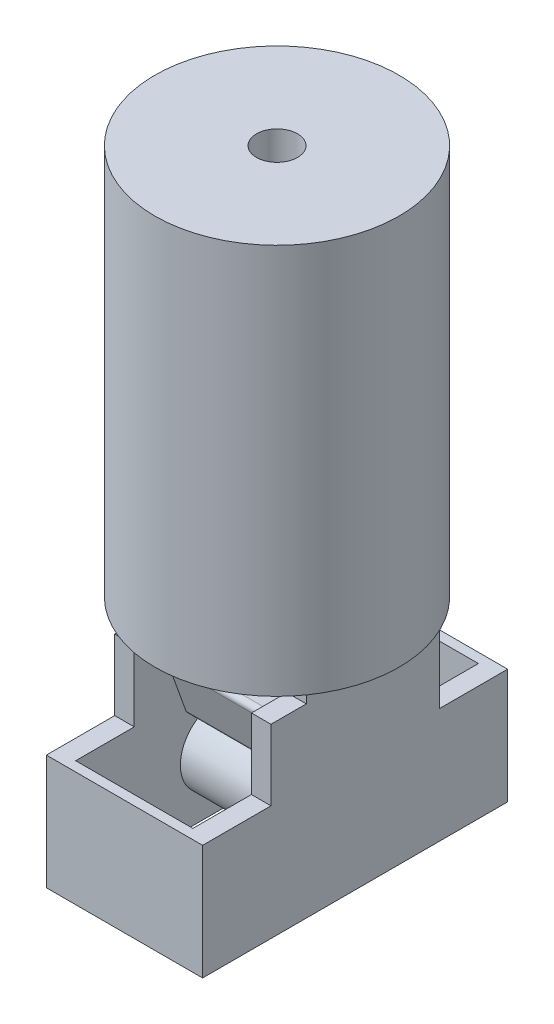
ISO-10303-21;
HEADER;
FILE_DESCRIPTION(('STEP AP214'),'2;1');
FILE_NAME('part.step','',(''),(''),'','','');
FILE_SCHEMA(('AUTOMOTIVE_DESIGN { 1 0 10303 214 1 1 1 1 }'));
ENDSEC;
DATA;
#1=APPLICATION_CONTEXT('core data for automotive mechanical design processes');
#2=APPLICATION_PROTOCOL_DEFINITION('international standard','automotive_design',2000,#1);
#3=PRODUCT_CONTEXT('',#1,'mechanical');
#4=PRODUCT('Part','Part','',(#3));
#5=PRODUCT_RELATED_PRODUCT_CATEGORY('part','',(#4));
#6=PRODUCT_DEFINITION_FORMATION('','',#4);
#7=PRODUCT_DEFINITION_CONTEXT('part definition',#1,'design');
#8=PRODUCT_DEFINITION('design','',#6,#7);
#9=PRODUCT_DEFINITION_SHAPE('','',#8);
#10=(LENGTH_UNIT() NAMED_UNIT(*) SI_UNIT(.MILLI.,.METRE.));
#11=(NAMED_UNIT(*) PLANE_ANGLE_UNIT() SI_UNIT($,.RADIAN.));
#12=(NAMED_UNIT(*) SI_UNIT($,.STERADIAN.) SOLID_ANGLE_UNIT());
#13=UNCERTAINTY_MEASURE_WITH_UNIT(LENGTH_MEASURE(1.E-05),#10,'distance_accuracy_value','');
#14=(GEOMETRIC_REPRESENTATION_CONTEXT(3) GLOBAL_UNCERTAINTY_ASSIGNED_CONTEXT((#13)) GLOBAL_UNIT_ASSIGNED_CONTEXT((#10,
#11,#12)) REPRESENTATION_CONTEXT('',''));
#15=CARTESIAN_POINT('',(0.,0.,0.));
#16=DIRECTION('',(0.,0.,1.));
#17=DIRECTION('',(1.,0.,0.));
#18=AXIS2_PLACEMENT_3D('',#15,#16,#17);
#19=CARTESIAN_POINT('',(12.,13.,14.6166247903554));
#20=DIRECTION('',(0.,-1.,0.));
#21=DIRECTION('',(0.,0.,-1.));
#22=AXIS2_PLACEMENT_3D('',#19,#20,#21);
#23=PLANE('',#22);
#24=DIRECTION('',(0.,0.,-1.));
#25=VECTOR('',#24,1.);
#26=CARTESIAN_POINT('',(-2.,13.,14.6166247903554));
#27=LINE('',#26,#25);
#28=CARTESIAN_POINT('',(-2.,13.,8.6166247903554));
#29=VERTEX_POINT('',#28);
#30=CARTESIAN_POINT('',(-2.,13.,5.));
#31=VERTEX_POINT('',#30);
#32=EDGE_CURVE('E381',#29,#31,#27,.T.);
#33=ORIENTED_EDGE('',*,*,#32,.F.);
#34=DIRECTION('',(-1.,0.,0.));
#35=VECTOR('',#34,1.);
#36=CARTESIAN_POINT('',(-2.,13.,8.6166247903554));
#37=LINE('',#36,#35);
#38=CARTESIAN_POINT('',(0.,13.,8.6166247903554));
#39=VERTEX_POINT('',#38);
#40=EDGE_CURVE('E254',#39,#29,#37,.T.);
#41=ORIENTED_EDGE('',*,*,#40,.F.);
#42=DIRECTION('',(0.,0.,-1.));
#43=VECTOR('',#42,1.);
#44=CARTESIAN_POINT('',(0.,13.,14.6166247903554));
#45=LINE('',#44,#43);
#46=CARTESIAN_POINT('',(0.,13.,5.));
#47=VERTEX_POINT('',#46);
#48=EDGE_CURVE('E384',#39,#47,#45,.T.);
#49=ORIENTED_EDGE('',*,*,#48,.T.);
#50=DIRECTION('',(1.,0.,0.));
#51=VECTOR('',#50,1.);
#52=CARTESIAN_POINT('',(-2.,13.,5.));
#53=LINE('',#52,#51);
#54=EDGE_CURVE('E461',#31,#47,#53,.T.);
#55=ORIENTED_EDGE('',*,*,#54,.F.);
#56=EDGE_LOOP('',(#33,#41,#49,#55));
#57=FACE_BOUND('',#56,.T.);
#58=ADVANCED_FACE('F39',(#57),#23,.F.);
#59=CARTESIAN_POINT('',(14.,13.,-14.6166247903554));
#60=DIRECTION('',(0.,-1.,0.));
#61=DIRECTION('',(0.,0.,-1.));
#62=AXIS2_PLACEMENT_3D('',#59,#60,#61);
#63=PLANE('',#62);
#64=DIRECTION('',(0.,0.,1.));
#65=VECTOR('',#64,1.);
#66=CARTESIAN_POINT('',(14.,13.,-14.6166247903554));
#67=LINE('',#66,#65);
#68=CARTESIAN_POINT('',(14.,13.,-8.6166247903554));
#69=VERTEX_POINT('',#68);
#70=CARTESIAN_POINT('',(14.,13.,-5.));
#71=VERTEX_POINT('',#70);
#72=EDGE_CURVE('E371',#69,#71,#67,.T.);
#73=ORIENTED_EDGE('',*,*,#72,.F.);
#74=DIRECTION('',(1.,0.,0.));
#75=VECTOR('',#74,1.);
#76=CARTESIAN_POINT('',(14.,13.,-8.6166247903554));
#77=LINE('',#76,#75);
#78=CARTESIAN_POINT('',(12.,13.,-8.6166247903554));
#79=VERTEX_POINT('',#78);
#80=EDGE_CURVE('E300',#79,#69,#77,.T.);
#81=ORIENTED_EDGE('',*,*,#80,.F.);
#82=DIRECTION('',(0.,0.,1.));
#83=VECTOR('',#82,1.);
#84=CARTESIAN_POINT('',(12.,13.,-14.6166247903554));
#85=LINE('',#84,#83);
#86=CARTESIAN_POINT('',(12.,13.,-5.));
#87=VERTEX_POINT('',#86);
#88=EDGE_CURVE('E374',#79,#87,#85,.T.);
#89=ORIENTED_EDGE('',*,*,#88,.T.);
#90=DIRECTION('',(-1.,0.,0.));
#91=VECTOR('',#90,1.);
#92=CARTESIAN_POINT('',(-2.,13.,-5.));
#93=LINE('',#92,#91);
#94=EDGE_CURVE('E474',#71,#87,#93,.T.);
#95=ORIENTED_EDGE('',*,*,#94,.F.);
#96=EDGE_LOOP('',(#73,#81,#89,#95));
#97=FACE_BOUND('',#96,.T.);
#98=ADVANCED_FACE('F648',(#97),#63,.F.);
#99=CARTESIAN_POINT('',(0.,13.,0.));
#100=DIRECTION('',(0.,1.,0.));
#101=DIRECTION('',(0.,0.,1.));
#102=AXIS2_PLACEMENT_3D('',#99,#100,#101);
#103=PLANE('',#102);
#104=DIRECTION('',(0.,0.,-1.));
#105=VECTOR('',#104,1.);
#106=CARTESIAN_POINT('',(0.,13.,3.3166247903554));
#107=LINE('',#106,#105);
#108=CARTESIAN_POINT('',(0.,13.,-5.));
#109=VERTEX_POINT('',#108);
#110=EDGE_CURVE('E499',#47,#109,#107,.T.);
#111=ORIENTED_EDGE('',*,*,#110,.T.);
#112=EDGE_CURVE('E479',#87,#109,#93,.T.);
#113=ORIENTED_EDGE('',*,*,#112,.F.);
#114=DIRECTION('',(0.,0.,1.));
#115=VECTOR('',#114,1.);
#116=CARTESIAN_POINT('',(12.,13.,-3.3166247903554));
#117=LINE('',#116,#115);
#118=CARTESIAN_POINT('',(12.,13.,5.));
#119=VERTEX_POINT('',#118);
#120=EDGE_CURVE('E503',#87,#119,#117,.T.);
#121=ORIENTED_EDGE('',*,*,#120,.T.);
#122=EDGE_CURVE('E483',#47,#119,#53,.T.);
#123=ORIENTED_EDGE('',*,*,#122,.F.);
#124=EDGE_LOOP('',(#111,#113,#121,#123));
#125=FACE_BOUND('',#124,.T.);
#126=ADVANCED_FACE('F632',(#125),#103,.F.);
#127=CARTESIAN_POINT('',(12.,0.,0.));
#128=DIRECTION('',(1.,0.,0.));
#129=DIRECTION('',(0.,0.,-1.));
#130=AXIS2_PLACEMENT_3D('',#127,#128,#129);
#131=PLANE('',#130);
#132=DIRECTION('',(0.,1.,0.));
#133=VECTOR('',#132,1.);
#134=CARTESIAN_POINT('',(12.,13.,-14.6166247903554));
#135=LINE('',#134,#133);
#136=CARTESIAN_POINT('',(12.,-6.,-14.6166247903554));
#137=VERTEX_POINT('',#136);
#138=CARTESIAN_POINT('',(12.,5.76669187086745,-14.6166247903554));
#139=VERTEX_POINT('',#138);
#140=EDGE_CURVE('E367',#137,#139,#135,.T.);
#141=ORIENTED_EDGE('',*,*,#140,.F.);
#142=DIRECTION('',(0.,0.,-1.));
#143=VECTOR('',#142,1.);
#144=CARTESIAN_POINT('',(12.,-6.,14.6166247903554));
#145=LINE('',#144,#143);
#146=CARTESIAN_POINT('',(12.,-6.,14.6166247903554));
#147=VERTEX_POINT('',#146);
#148=EDGE_CURVE('E405',#147,#137,#145,.T.);
#149=ORIENTED_EDGE('',*,*,#148,.F.);
#150=DIRECTION('',(0.,-1.,0.));
#151=VECTOR('',#150,1.);
#152=CARTESIAN_POINT('',(12.,-6.,14.6166247903554));
#153=LINE('',#152,#151);
#154=CARTESIAN_POINT('',(12.,5.76669187086745,14.6166247903554));
#155=VERTEX_POINT('',#154);
#156=EDGE_CURVE('E393',#155,#147,#153,.T.);
#157=ORIENTED_EDGE('',*,*,#156,.F.);
#158=DIRECTION('',(0.,0.,-1.));
#159=VECTOR('',#158,1.);
#160=CARTESIAN_POINT('',(12.,5.76669187086745,0.));
#161=LINE('',#160,#159);
#162=CARTESIAN_POINT('',(12.,5.76669187086745,8.6166247903554));
#163=VERTEX_POINT('',#162);
#164=EDGE_CURVE('E54',#155,#163,#161,.T.);
#165=ORIENTED_EDGE('',*,*,#164,.T.);
#166=DIRECTION('',(0.,1.,0.));
#167=VECTOR('',#166,1.);
#168=CARTESIAN_POINT('',(12.,0.,8.6166247903554));
#169=LINE('',#168,#167);
#170=CARTESIAN_POINT('',(12.,13.,8.6166247903554));
#171=VERTEX_POINT('',#170);
#172=EDGE_CURVE('E283',#163,#171,#169,.T.);
#173=ORIENTED_EDGE('',*,*,#172,.T.);
#174=DIRECTION('',(0.,0.,-1.));
#175=VECTOR('',#174,1.);
#176=CARTESIAN_POINT('',(12.,13.,14.6166247903554));
#177=LINE('',#176,#175);
#178=EDGE_CURVE('E396',#171,#119,#177,.T.);
#179=ORIENTED_EDGE('',*,*,#178,.T.);
#180=ORIENTED_EDGE('',*,*,#120,.F.);
#181=ORIENTED_EDGE('',*,*,#88,.F.);
#182=DIRECTION('',(0.,-1.,0.));
#183=VECTOR('',#182,1.);
#184=CARTESIAN_POINT('',(12.,0.,-8.6166247903554));
#185=LINE('',#184,#183);
#186=CARTESIAN_POINT('',(12.,5.76669187086745,-8.6166247903554));
#187=VERTEX_POINT('',#186);
#188=EDGE_CURVE('E323',#79,#187,#185,.T.);
#189=ORIENTED_EDGE('',*,*,#188,.T.);
#190=DIRECTION('',(0.,0.,-1.));
#191=VECTOR('',#190,1.);
#192=CARTESIAN_POINT('',(12.,5.76669187086745,0.));
#193=LINE('',#192,#191);
#194=EDGE_CURVE('E315',#187,#139,#193,.T.);
#195=ORIENTED_EDGE('',*,*,#194,.T.);
#196=EDGE_LOOP('',(#141,#149,#157,#165,#173,#179,#180,#181,#189,#195));
#197=FACE_BOUND('',#196,.T.);
#198=CARTESIAN_POINT('',(12.,4.7,-2.84858678977654));
#199=DIRECTION('',(1.,0.,0.));
#200=DIRECTION('',(0.,0.,-1.));
#201=AXIS2_PLACEMENT_3D('',#198,#199,#200);
#202=CIRCLE('',#201,0.5);
#203=CARTESIAN_POINT('',(12.,4.2,-2.84858678977654));
#204=VERTEX_POINT('',#203);
#205=CARTESIAN_POINT('',(12.,4.53064026586363,-3.31903049571091));
#206=VERTEX_POINT('',#205);
#207=EDGE_CURVE('E559',#204,#206,#202,.T.);
#208=ORIENTED_EDGE('',*,*,#207,.T.);
#209=DIRECTION('',(0.,-0.940887411868727,0.338719468272742));
#210=VECTOR('',#209,1.);
#211=CARTESIAN_POINT('',(12.,9.2,-5.));
#212=LINE('',#211,#210);
#213=CARTESIAN_POINT('',(12.,9.53064026586363,-5.11903049571091));
#214=VERTEX_POINT('',#213);
#215=EDGE_CURVE('E409',#214,#206,#212,.T.);
#216=ORIENTED_EDGE('',*,*,#215,.F.);
#217=CARTESIAN_POINT('',(12.,9.7,-4.64858678977655));
#218=DIRECTION('',(-1.,0.,0.));
#219=DIRECTION('',(0.,0.,1.));
#220=AXIS2_PLACEMENT_3D('',#217,#218,#219);
#221=CIRCLE('',#220,0.5);
#222=CARTESIAN_POINT('',(12.,10.2,-4.64858678977655));
#223=VERTEX_POINT('',#222);
#224=EDGE_CURVE('E522',#214,#223,#221,.F.);
#225=ORIENTED_EDGE('',*,*,#224,.T.);
#226=DIRECTION('',(0.,0.,-1.));
#227=VECTOR('',#226,1.);
#228=CARTESIAN_POINT('',(12.,10.2,-5.36));
#229=LINE('',#228,#227);
#230=CARTESIAN_POINT('',(12.,10.2,4.64858678977654));
#231=VERTEX_POINT('',#230);
#232=EDGE_CURVE('E414',#231,#223,#229,.T.);
#233=ORIENTED_EDGE('',*,*,#232,.F.);
#234=CARTESIAN_POINT('',(12.,9.7,4.64858678977654));
#235=DIRECTION('',(-1.,0.,0.));
#236=DIRECTION('',(0.,0.,1.));
#237=AXIS2_PLACEMENT_3D('',#234,#235,#236);
#238=CIRCLE('',#237,0.5);
#239=CARTESIAN_POINT('',(12.,9.53064026586363,5.1190304957109));
#240=VERTEX_POINT('',#239);
#241=EDGE_CURVE('E537',#231,#240,#238,.F.);
#242=ORIENTED_EDGE('',*,*,#241,.T.);
#243=DIRECTION('',(0.,0.940887411868727,0.338719468272741));
#244=VECTOR('',#243,1.);
#245=CARTESIAN_POINT('',(12.,10.2,5.36));
#246=LINE('',#245,#244);
#247=CARTESIAN_POINT('',(12.,4.53064026586363,3.31903049571091));
#248=VERTEX_POINT('',#247);
#249=EDGE_CURVE('E417',#248,#240,#246,.T.);
#250=ORIENTED_EDGE('',*,*,#249,.F.);
#251=CARTESIAN_POINT('',(12.,4.7,2.84858678977654));
#252=DIRECTION('',(1.,0.,0.));
#253=DIRECTION('',(0.,0.,-1.));
#254=AXIS2_PLACEMENT_3D('',#251,#252,#253);
#255=CIRCLE('',#254,0.5);
#256=CARTESIAN_POINT('',(12.,4.2,2.84858678977654));
#257=VERTEX_POINT('',#256);
#258=EDGE_CURVE('E565',#248,#257,#255,.T.);
#259=ORIENTED_EDGE('',*,*,#258,.T.);
#260=DIRECTION('',(0.,0.,1.));
#261=VECTOR('',#260,1.);
#262=CARTESIAN_POINT('',(12.,4.2,-3.2));
#263=LINE('',#262,#261);
#264=EDGE_CURVE('E408',#204,#257,#263,.T.);
#265=ORIENTED_EDGE('',*,*,#264,.F.);
#266=EDGE_LOOP('',(#208,#216,#225,#233,#242,#250,#259,#265));
#267=FACE_BOUND('',#266,.T.);
#268=CARTESIAN_POINT('',(12.,0.,0.));
#269=DIRECTION('',(1.,0.,0.));
#270=DIRECTION('',(0.,0.,-1.));
#271=AXIS2_PLACEMENT_3D('',#268,#269,#270);
#272=CIRCLE('',#271,3.9);
#273=CARTESIAN_POINT('',(12.,0.,-3.9));
#274=VERTEX_POINT('',#273);
#275=EDGE_CURVE('E508',#274,#274,#272,.T.);
#276=ORIENTED_EDGE('',*,*,#275,.T.);
#277=EDGE_LOOP('',(#276));
#278=FACE_BOUND('',#277,.T.);
#279=ADVANCED_FACE('F577',(#197,#267,#278),#131,.F.);
#280=CARTESIAN_POINT('',(0.,0.,0.));
#281=DIRECTION('',(-1.,0.,0.));
#282=DIRECTION('',(0.,0.,1.));
#283=AXIS2_PLACEMENT_3D('',#280,#281,#282);
#284=PLANE('',#283);
#285=DIRECTION('',(0.,0.,-1.));
#286=VECTOR('',#285,1.);
#287=CARTESIAN_POINT('',(0.,-6.,14.6166247903554));
#288=LINE('',#287,#286);
#289=CARTESIAN_POINT('',(0.,-6.,14.6166247903554));
#290=VERTEX_POINT('',#289);
#291=CARTESIAN_POINT('',(0.,-6.,-14.6166247903554));
#292=VERTEX_POINT('',#291);
#293=EDGE_CURVE('E387',#290,#292,#288,.T.);
#294=ORIENTED_EDGE('',*,*,#293,.T.);
#295=DIRECTION('',(0.,-1.,0.));
#296=VECTOR('',#295,1.);
#297=CARTESIAN_POINT('',(0.,-6.,-14.6166247903554));
#298=LINE('',#297,#296);
#299=CARTESIAN_POINT('',(0.,5.76669187086745,-14.6166247903554));
#300=VERTEX_POINT('',#299);
#301=EDGE_CURVE('E354',#300,#292,#298,.T.);
#302=ORIENTED_EDGE('',*,*,#301,.F.);
#303=DIRECTION('',(0.,0.,1.));
#304=VECTOR('',#303,1.);
#305=CARTESIAN_POINT('',(0.,5.76669187086745,0.));
#306=LINE('',#305,#304);
#307=CARTESIAN_POINT('',(0.,5.76669187086745,-8.6166247903554));
#308=VERTEX_POINT('',#307);
#309=EDGE_CURVE('E62',#300,#308,#306,.T.);
#310=ORIENTED_EDGE('',*,*,#309,.T.);
#311=DIRECTION('',(0.,1.,0.));
#312=VECTOR('',#311,1.);
#313=CARTESIAN_POINT('',(0.,0.,-8.6166247903554));
#314=LINE('',#313,#312);
#315=CARTESIAN_POINT('',(0.,13.,-8.6166247903554));
#316=VERTEX_POINT('',#315);
#317=EDGE_CURVE('E319',#308,#316,#314,.T.);
#318=ORIENTED_EDGE('',*,*,#317,.T.);
#319=DIRECTION('',(0.,0.,1.));
#320=VECTOR('',#319,1.);
#321=CARTESIAN_POINT('',(0.,13.,-14.6166247903554));
#322=LINE('',#321,#320);
#323=EDGE_CURVE('E361',#316,#109,#322,.T.);
#324=ORIENTED_EDGE('',*,*,#323,.T.);
#325=ORIENTED_EDGE('',*,*,#110,.F.);
#326=ORIENTED_EDGE('',*,*,#48,.F.);
#327=DIRECTION('',(0.,-1.,0.));
#328=VECTOR('',#327,1.);
#329=CARTESIAN_POINT('',(0.,0.,8.6166247903554));
#330=LINE('',#329,#328);
#331=CARTESIAN_POINT('',(0.,5.76669187086745,8.6166247903554));
#332=VERTEX_POINT('',#331);
#333=EDGE_CURVE('E280',#39,#332,#330,.T.);
#334=ORIENTED_EDGE('',*,*,#333,.T.);
#335=DIRECTION('',(0.,0.,1.));
#336=VECTOR('',#335,1.);
#337=CARTESIAN_POINT('',(0.,5.76669187086745,0.));
#338=LINE('',#337,#336);
#339=CARTESIAN_POINT('',(0.,5.76669187086745,14.6166247903554));
#340=VERTEX_POINT('',#339);
#341=EDGE_CURVE('E243',#332,#340,#338,.T.);
#342=ORIENTED_EDGE('',*,*,#341,.T.);
#343=DIRECTION('',(0.,1.,0.));
#344=VECTOR('',#343,1.);
#345=CARTESIAN_POINT('',(0.,13.,14.6166247903554));
#346=LINE('',#345,#344);
#347=EDGE_CURVE('E377',#290,#340,#346,.T.);
#348=ORIENTED_EDGE('',*,*,#347,.F.);
#349=EDGE_LOOP('',(#294,#302,#310,#318,#324,#325,#326,#334,#342,#348));
#350=FACE_BOUND('',#349,.T.);
#351=CARTESIAN_POINT('',(0.,4.7,-2.84858678977654));
#352=DIRECTION('',(-1.,0.,0.));
#353=DIRECTION('',(0.,0.,1.));
#354=AXIS2_PLACEMENT_3D('',#351,#352,#353);
#355=CIRCLE('',#354,0.5);
#356=CARTESIAN_POINT('',(0.,4.53064026586363,-3.31903049571091));
#357=VERTEX_POINT('',#356);
#358=CARTESIAN_POINT('',(0.,4.2,-2.84858678977654));
#359=VERTEX_POINT('',#358);
#360=EDGE_CURVE('E562',#357,#359,#355,.T.);
#361=ORIENTED_EDGE('',*,*,#360,.T.);
#362=DIRECTION('',(0.,0.,1.));
#363=VECTOR('',#362,1.);
#364=CARTESIAN_POINT('',(0.,4.2,-3.2));
#365=LINE('',#364,#363);
#366=CARTESIAN_POINT('',(0.,4.2,2.84858678977654));
#367=VERTEX_POINT('',#366);
#368=EDGE_CURVE('E433',#359,#367,#365,.T.);
#369=ORIENTED_EDGE('',*,*,#368,.T.);
#370=CARTESIAN_POINT('',(0.,4.7,2.84858678977654));
#371=DIRECTION('',(-1.,0.,0.));
#372=DIRECTION('',(0.,0.,1.));
#373=AXIS2_PLACEMENT_3D('',#370,#371,#372);
#374=CIRCLE('',#373,0.5);
#375=CARTESIAN_POINT('',(0.,4.53064026586363,3.31903049571091));
#376=VERTEX_POINT('',#375);
#377=EDGE_CURVE('E568',#367,#376,#374,.T.);
#378=ORIENTED_EDGE('',*,*,#377,.T.);
#379=DIRECTION('',(0.,0.940887411868727,0.338719468272741));
#380=VECTOR('',#379,1.);
#381=CARTESIAN_POINT('',(0.,10.2,5.36));
#382=LINE('',#381,#380);
#383=CARTESIAN_POINT('',(0.,9.53064026586363,5.1190304957109));
#384=VERTEX_POINT('',#383);
#385=EDGE_CURVE('E429',#376,#384,#382,.T.);
#386=ORIENTED_EDGE('',*,*,#385,.T.);
#387=CARTESIAN_POINT('',(0.,9.7,4.64858678977654));
#388=DIRECTION('',(-1.,0.,0.));
#389=DIRECTION('',(0.,0.,1.));
#390=AXIS2_PLACEMENT_3D('',#387,#388,#389);
#391=CIRCLE('',#390,0.5);
#392=CARTESIAN_POINT('',(0.,10.2,4.64858678977654));
#393=VERTEX_POINT('',#392);
#394=EDGE_CURVE('E548',#384,#393,#391,.T.);
#395=ORIENTED_EDGE('',*,*,#394,.T.);
#396=DIRECTION('',(0.,0.,-1.));
#397=VECTOR('',#396,1.);
#398=CARTESIAN_POINT('',(0.,10.2,-5.36));
#399=LINE('',#398,#397);
#400=CARTESIAN_POINT('',(0.,10.2,-4.64858678977655));
#401=VERTEX_POINT('',#400);
#402=EDGE_CURVE('E424',#393,#401,#399,.T.);
#403=ORIENTED_EDGE('',*,*,#402,.T.);
#404=CARTESIAN_POINT('',(0.,9.7,-4.64858678977655));
#405=DIRECTION('',(-1.,0.,0.));
#406=DIRECTION('',(0.,0.,1.));
#407=AXIS2_PLACEMENT_3D('',#404,#405,#406);
#408=CIRCLE('',#407,0.5);
#409=CARTESIAN_POINT('',(0.,9.53064026586363,-5.11903049571091));
#410=VERTEX_POINT('',#409);
#411=EDGE_CURVE('E533',#401,#410,#408,.T.);
#412=ORIENTED_EDGE('',*,*,#411,.T.);
#413=DIRECTION('',(0.,-0.940887411868727,0.338719468272742));
#414=VECTOR('',#413,1.);
#415=CARTESIAN_POINT('',(0.,9.2,-5.));
#416=LINE('',#415,#414);
#417=EDGE_CURVE('E413',#410,#357,#416,.T.);
#418=ORIENTED_EDGE('',*,*,#417,.T.);
#419=EDGE_LOOP('',(#361,#369,#378,#386,#395,#403,#412,#418));
#420=FACE_BOUND('',#419,.T.);
#421=CARTESIAN_POINT('',(0.,0.,0.));
#422=DIRECTION('',(1.,0.,0.));
#423=DIRECTION('',(0.,0.,-1.));
#424=AXIS2_PLACEMENT_3D('',#421,#422,#423);
#425=CIRCLE('',#424,3.9);
#426=CARTESIAN_POINT('',(0.,0.,-3.9));
#427=VERTEX_POINT('',#426);
#428=EDGE_CURVE('E507',#427,#427,#425,.T.);
#429=ORIENTED_EDGE('',*,*,#428,.F.);
#430=EDGE_LOOP('',(#429));
#431=FACE_BOUND('',#430,.T.);
#432=ADVANCED_FACE('F592',(#350,#420,#431),#284,.F.);
#433=CARTESIAN_POINT('',(14.,0.,0.));
#434=DIRECTION('',(1.,0.,0.));
#435=DIRECTION('',(0.,0.,-1.));
#436=AXIS2_PLACEMENT_3D('',#433,#434,#435);
#437=PLANE('',#436);
#438=DIRECTION('',(0.,0.,-1.));
#439=VECTOR('',#438,1.);
#440=CARTESIAN_POINT('',(14.,-6.,14.6166247903554));
#441=LINE('',#440,#439);
#442=CARTESIAN_POINT('',(14.,-6.,15.6166247903554));
#443=VERTEX_POINT('',#442);
#444=CARTESIAN_POINT('',(14.,-6.,-15.6166247903554));
#445=VERTEX_POINT('',#444);
#446=EDGE_CURVE('E402',#443,#445,#441,.T.);
#447=ORIENTED_EDGE('',*,*,#446,.T.);
#448=DIRECTION('',(0.,-1.,0.));
#449=VECTOR('',#448,1.);
#450=CARTESIAN_POINT('',(14.,-6.,-15.6166247903554));
#451=LINE('',#450,#449);
#452=CARTESIAN_POINT('',(14.,5.76669187086745,-15.6166247903554));
#453=VERTEX_POINT('',#452);
#454=EDGE_CURVE('E328',#453,#445,#451,.T.);
#455=ORIENTED_EDGE('',*,*,#454,.F.);
#456=DIRECTION('',(0.,0.,-1.));
#457=VECTOR('',#456,1.);
#458=CARTESIAN_POINT('',(14.,5.76669187086745,-8.6166247903554));
#459=LINE('',#458,#457);
#460=CARTESIAN_POINT('',(14.,5.76669187086745,-8.6166247903554));
#461=VERTEX_POINT('',#460);
#462=EDGE_CURVE('E304',#461,#453,#459,.T.);
#463=ORIENTED_EDGE('',*,*,#462,.F.);
#464=DIRECTION('',(0.,-1.,0.));
#465=VECTOR('',#464,1.);
#466=CARTESIAN_POINT('',(14.,5.76669187086745,-8.6166247903554));
#467=LINE('',#466,#465);
#468=EDGE_CURVE('E288',#69,#461,#467,.T.);
#469=ORIENTED_EDGE('',*,*,#468,.F.);
#470=ORIENTED_EDGE('',*,*,#72,.T.);
#471=DIRECTION('',(0.,-1.,0.));
#472=VECTOR('',#471,1.);
#473=CARTESIAN_POINT('',(14.,16.,-5.));
#474=LINE('',#473,#472);
#475=CARTESIAN_POINT('',(14.,16.,-5.));
#476=VERTEX_POINT('',#475);
#477=EDGE_CURVE('E495',#476,#71,#474,.T.);
#478=ORIENTED_EDGE('',*,*,#477,.F.);
#479=DIRECTION('',(0.,0.,-1.));
#480=VECTOR('',#479,1.);
#481=CARTESIAN_POINT('',(14.,16.,-5.));
#482=LINE('',#481,#480);
#483=CARTESIAN_POINT('',(14.,16.,5.));
#484=VERTEX_POINT('',#483);
#485=EDGE_CURVE('E456',#484,#476,#482,.T.);
#486=ORIENTED_EDGE('',*,*,#485,.F.);
#487=DIRECTION('',(0.,-1.,0.));
#488=VECTOR('',#487,1.);
#489=CARTESIAN_POINT('',(14.,16.,5.));
#490=LINE('',#489,#488);
#491=CARTESIAN_POINT('',(14.,13.,5.));
#492=VERTEX_POINT('',#491);
#493=EDGE_CURVE('E473',#484,#492,#490,.T.);
#494=ORIENTED_EDGE('',*,*,#493,.T.);
#495=DIRECTION('',(0.,0.,-1.));
#496=VECTOR('',#495,1.);
#497=CARTESIAN_POINT('',(14.,13.,14.6166247903554));
#498=LINE('',#497,#496);
#499=CARTESIAN_POINT('',(14.,13.,8.6166247903554));
#500=VERTEX_POINT('',#499);
#501=EDGE_CURVE('E399',#500,#492,#498,.T.);
#502=ORIENTED_EDGE('',*,*,#501,.F.);
#503=DIRECTION('',(0.,1.,0.));
#504=VECTOR('',#503,1.);
#505=CARTESIAN_POINT('',(14.,13.,8.6166247903554));
#506=LINE('',#505,#504);
#507=CARTESIAN_POINT('',(14.,5.76669187086745,8.6166247903554));
#508=VERTEX_POINT('',#507);
#509=EDGE_CURVE('E247',#508,#500,#506,.T.);
#510=ORIENTED_EDGE('',*,*,#509,.F.);
#511=DIRECTION('',(0.,0.,1.));
#512=VECTOR('',#511,1.);
#513=CARTESIAN_POINT('',(14.,5.76669187086745,8.6166247903554));
#514=LINE('',#513,#512);
#515=CARTESIAN_POINT('',(14.,5.76669187086745,15.6166247903554));
#516=VERTEX_POINT('',#515);
#517=EDGE_CURVE('E266',#508,#516,#514,.T.);
#518=ORIENTED_EDGE('',*,*,#517,.T.);
#519=DIRECTION('',(0.,1.,0.));
#520=VECTOR('',#519,1.);
#521=CARTESIAN_POINT('',(14.,13.,15.6166247903554));
#522=LINE('',#521,#520);
#523=EDGE_CURVE('E350',#443,#516,#522,.T.);
#524=ORIENTED_EDGE('',*,*,#523,.F.);
#525=EDGE_LOOP('',(#447,#455,#463,#469,#470,#478,#486,#494,#502,#510,#518,#524));
#526=FACE_BOUND('',#525,.T.);
#527=ADVANCED_FACE('F607',(#526),#437,.T.);
#528=CARTESIAN_POINT('',(-2.,0.,0.));
#529=DIRECTION('',(-1.,0.,0.));
#530=DIRECTION('',(0.,0.,1.));
#531=AXIS2_PLACEMENT_3D('',#528,#529,#530);
#532=PLANE('',#531);
#533=DIRECTION('',(0.,1.,0.));
#534=VECTOR('',#533,1.);
#535=CARTESIAN_POINT('',(-2.,13.,-15.6166247903554));
#536=LINE('',#535,#534);
#537=CARTESIAN_POINT('',(-2.,-6.,-15.6166247903554));
#538=VERTEX_POINT('',#537);
#539=CARTESIAN_POINT('',(-2.,5.76669187086745,-15.6166247903554));
#540=VERTEX_POINT('',#539);
#541=EDGE_CURVE('E336',#538,#540,#536,.T.);
#542=ORIENTED_EDGE('',*,*,#541,.F.);
#543=DIRECTION('',(0.,0.,-1.));
#544=VECTOR('',#543,1.);
#545=CARTESIAN_POINT('',(-2.,-6.,14.6166247903554));
#546=LINE('',#545,#544);
#547=CARTESIAN_POINT('',(-2.,-6.,15.6166247903554));
#548=VERTEX_POINT('',#547);
#549=EDGE_CURVE('E390',#548,#538,#546,.T.);
#550=ORIENTED_EDGE('',*,*,#549,.F.);
#551=DIRECTION('',(0.,-1.,0.));
#552=VECTOR('',#551,1.);
#553=CARTESIAN_POINT('',(-2.,-6.,15.6166247903554));
#554=LINE('',#553,#552);
#555=CARTESIAN_POINT('',(-2.,5.76669187086745,15.6166247903554));
#556=VERTEX_POINT('',#555);
#557=EDGE_CURVE('E264',#556,#548,#554,.T.);
#558=ORIENTED_EDGE('',*,*,#557,.F.);
#559=DIRECTION('',(0.,0.,1.));
#560=VECTOR('',#559,1.);
#561=CARTESIAN_POINT('',(-2.,5.76669187086745,8.6166247903554));
#562=LINE('',#561,#560);
#563=CARTESIAN_POINT('',(-2.,5.76669187086745,8.6166247903554));
#564=VERTEX_POINT('',#563);
#565=EDGE_CURVE('E240',#564,#556,#562,.T.);
#566=ORIENTED_EDGE('',*,*,#565,.F.);
#567=DIRECTION('',(0.,-1.,0.));
#568=VECTOR('',#567,1.);
#569=CARTESIAN_POINT('',(-2.,5.76669187086745,8.6166247903554));
#570=LINE('',#569,#568);
#571=EDGE_CURVE('E251',#29,#564,#570,.T.);
#572=ORIENTED_EDGE('',*,*,#571,.F.);
#573=ORIENTED_EDGE('',*,*,#32,.T.);
#574=DIRECTION('',(0.,-1.,0.));
#575=VECTOR('',#574,1.);
#576=CARTESIAN_POINT('',(-2.,16.,5.));
#577=LINE('',#576,#575);
#578=CARTESIAN_POINT('',(-2.,16.,5.));
#579=VERTEX_POINT('',#578);
#580=EDGE_CURVE('E487',#579,#31,#577,.T.);
#581=ORIENTED_EDGE('',*,*,#580,.F.);
#582=DIRECTION('',(0.,0.,1.));
#583=VECTOR('',#582,1.);
#584=CARTESIAN_POINT('',(-2.,16.,-5.));
#585=LINE('',#584,#583);
#586=CARTESIAN_POINT('',(-2.,16.,-5.));
#587=VERTEX_POINT('',#586);
#588=EDGE_CURVE('E465',#587,#579,#585,.T.);
#589=ORIENTED_EDGE('',*,*,#588,.F.);
#590=DIRECTION('',(0.,-1.,0.));
#591=VECTOR('',#590,1.);
#592=CARTESIAN_POINT('',(-2.,16.,-5.));
#593=LINE('',#592,#591);
#594=CARTESIAN_POINT('',(-2.,13.,-5.));
#595=VERTEX_POINT('',#594);
#596=EDGE_CURVE('E491',#587,#595,#593,.T.);
#597=ORIENTED_EDGE('',*,*,#596,.T.);
#598=DIRECTION('',(0.,0.,1.));
#599=VECTOR('',#598,1.);
#600=CARTESIAN_POINT('',(-2.,13.,-14.6166247903554));
#601=LINE('',#600,#599);
#602=CARTESIAN_POINT('',(-2.,13.,-8.6166247903554));
#603=VERTEX_POINT('',#602);
#604=EDGE_CURVE('E364',#603,#595,#601,.T.);
#605=ORIENTED_EDGE('',*,*,#604,.F.);
#606=DIRECTION('',(0.,1.,0.));
#607=VECTOR('',#606,1.);
#608=CARTESIAN_POINT('',(-2.,13.,-8.6166247903554));
#609=LINE('',#608,#607);
#610=CARTESIAN_POINT('',(-2.,5.76669187086745,-8.6166247903554));
#611=VERTEX_POINT('',#610);
#612=EDGE_CURVE('E297',#611,#603,#609,.T.);
#613=ORIENTED_EDGE('',*,*,#612,.F.);
#614=DIRECTION('',(0.,0.,-1.));
#615=VECTOR('',#614,1.);
#616=CARTESIAN_POINT('',(-2.,5.76669187086745,-8.6166247903554));
#617=LINE('',#616,#615);
#618=EDGE_CURVE('E307',#611,#540,#617,.T.);
#619=ORIENTED_EDGE('',*,*,#618,.T.);
#620=EDGE_LOOP('',(#542,#550,#558,#566,#572,#573,#581,#589,#597,#605,#613,#619));
#621=FACE_BOUND('',#620,.T.);
#622=ADVANCED_FACE('F262',(#621),#532,.T.);
#623=CARTESIAN_POINT('',(12.,0.,0.));
#624=DIRECTION('',(-1.,0.,0.));
#625=DIRECTION('',(0.,0.,1.));
#626=AXIS2_PLACEMENT_3D('',#623,#624,#625);
#627=CYLINDRICAL_SURFACE('',#626,3.9);
#628=ORIENTED_EDGE('',*,*,#275,.F.);
#629=EDGE_LOOP('',(#628));
#630=FACE_BOUND('',#629,.T.);
#631=ORIENTED_EDGE('',*,*,#428,.T.);
#632=EDGE_LOOP('',(#631));
#633=FACE_BOUND('',#632,.T.);
#634=ADVANCED_FACE('F815',(#630,#633),#627,.T.);
#635=CARTESIAN_POINT('',(-2.,16.,-5.));
#636=DIRECTION('',(0.,0.,1.));
#637=DIRECTION('',(1.,0.,0.));
#638=AXIS2_PLACEMENT_3D('',#635,#636,#637);
#639=PLANE('',#638);
#640=ORIENTED_EDGE('',*,*,#94,.T.);
#641=ORIENTED_EDGE('',*,*,#112,.T.);
#642=EDGE_CURVE('E452',#109,#595,#93,.T.);
#643=ORIENTED_EDGE('',*,*,#642,.T.);
#644=ORIENTED_EDGE('',*,*,#596,.F.);
#645=DIRECTION('',(-1.,0.,0.));
#646=VECTOR('',#645,1.);
#647=CARTESIAN_POINT('',(-2.,16.,-5.));
#648=LINE('',#647,#646);
#649=EDGE_CURVE('E460',#476,#587,#648,.T.);
#650=ORIENTED_EDGE('',*,*,#649,.F.);
#651=ORIENTED_EDGE('',*,*,#477,.T.);
#652=EDGE_LOOP('',(#640,#641,#643,#644,#650,#651));
#653=FACE_BOUND('',#652,.T.);
#654=ADVANCED_FACE('F635',(#653),#639,.F.);
#655=CARTESIAN_POINT('',(-2.,16.,5.));
#656=DIRECTION('',(0.,0.,-1.));
#657=DIRECTION('',(-1.,0.,0.));
#658=AXIS2_PLACEMENT_3D('',#655,#656,#657);
#659=PLANE('',#658);
#660=ORIENTED_EDGE('',*,*,#54,.T.);
#661=ORIENTED_EDGE('',*,*,#122,.T.);
#662=EDGE_CURVE('E478',#119,#492,#53,.T.);
#663=ORIENTED_EDGE('',*,*,#662,.T.);
#664=ORIENTED_EDGE('',*,*,#493,.F.);
#665=DIRECTION('',(1.,0.,0.));
#666=VECTOR('',#665,1.);
#667=CARTESIAN_POINT('',(-2.,16.,5.));
#668=LINE('',#667,#666);
#669=EDGE_CURVE('E469',#579,#484,#668,.T.);
#670=ORIENTED_EDGE('',*,*,#669,.F.);
#671=ORIENTED_EDGE('',*,*,#580,.T.);
#672=EDGE_LOOP('',(#660,#661,#663,#664,#670,#671));
#673=FACE_BOUND('',#672,.T.);
#674=ADVANCED_FACE('F660',(#673),#659,.F.);
#675=CARTESIAN_POINT('',(6.,16.,0.));
#676=DIRECTION('',(0.,1.,0.));
#677=DIRECTION('',(0.,0.,1.));
#678=AXIS2_PLACEMENT_3D('',#675,#676,#677);
#679=PLANE('',#678);
#680=CARTESIAN_POINT('',(6.,16.,0.));
#681=DIRECTION('',(0.,1.,0.));
#682=DIRECTION('',(0.,0.,1.));
#683=AXIS2_PLACEMENT_3D('',#680,#681,#682);
#684=CIRCLE('',#683,12.5);
#685=CARTESIAN_POINT('',(6.,16.,12.5));
#686=VERTEX_POINT('',#685);
#687=EDGE_CURVE('E444',#686,#686,#684,.T.);
#688=ORIENTED_EDGE('',*,*,#687,.F.);
#689=EDGE_LOOP('',(#688));
#690=FACE_BOUND('',#689,.T.);
#691=ORIENTED_EDGE('',*,*,#669,.T.);
#692=ORIENTED_EDGE('',*,*,#485,.T.);
#693=ORIENTED_EDGE('',*,*,#649,.T.);
#694=ORIENTED_EDGE('',*,*,#588,.T.);
#695=EDGE_LOOP('',(#691,#692,#693,#694));
#696=FACE_BOUND('',#695,.T.);
#697=ADVANCED_FACE('F664',(#690,#696),#679,.F.);
#698=CARTESIAN_POINT('',(6.,56.,0.));
#699=DIRECTION('',(0.,-1.,0.));
#700=DIRECTION('',(0.,0.,-1.));
#701=AXIS2_PLACEMENT_3D('',#698,#699,#700);
#702=CYLINDRICAL_SURFACE('',#701,12.5);
#703=CARTESIAN_POINT('',(6.,56.,0.));
#704=DIRECTION('',(0.,1.,0.));
#705=DIRECTION('',(0.,0.,1.));
#706=AXIS2_PLACEMENT_3D('',#703,#704,#705);
#707=CIRCLE('',#706,12.5);
#708=CARTESIAN_POINT('',(6.,56.,12.5));
#709=VERTEX_POINT('',#708);
#710=EDGE_CURVE('E448',#709,#709,#707,.T.);
#711=ORIENTED_EDGE('',*,*,#710,.F.);
#712=EDGE_LOOP('',(#711));
#713=FACE_BOUND('',#712,.T.);
#714=ORIENTED_EDGE('',*,*,#687,.T.);
#715=EDGE_LOOP('',(#714));
#716=FACE_BOUND('',#715,.T.);
#717=ADVANCED_FACE('F666',(#713,#716),#702,.T.);
#718=CARTESIAN_POINT('',(6.,56.,0.));
#719=DIRECTION('',(0.,1.,0.));
#720=DIRECTION('',(0.,0.,1.));
#721=AXIS2_PLACEMENT_3D('',#718,#719,#720);
#722=PLANE('',#721);
#723=CARTESIAN_POINT('',(6.,56.,0.));
#724=DIRECTION('',(0.,1.,0.));
#725=DIRECTION('',(0.,0.,1.));
#726=AXIS2_PLACEMENT_3D('',#723,#724,#725);
#727=CIRCLE('',#726,2.1);
#728=CARTESIAN_POINT('',(6.,56.,2.1));
#729=VERTEX_POINT('',#728);
#730=EDGE_CURVE('E428',#729,#729,#727,.T.);
#731=ORIENTED_EDGE('',*,*,#730,.F.);
#732=EDGE_LOOP('',(#731));
#733=FACE_BOUND('',#732,.T.);
#734=ORIENTED_EDGE('',*,*,#710,.T.);
#735=EDGE_LOOP('',(#734));
#736=FACE_BOUND('',#735,.T.);
#737=ADVANCED_FACE('F673',(#733,#736),#722,.T.);
#738=CARTESIAN_POINT('',(6.,35.,0.));
#739=DIRECTION('',(0.,1.,0.));
#740=DIRECTION('',(0.,0.,1.));
#741=AXIS2_PLACEMENT_3D('',#738,#739,#740);
#742=CYLINDRICAL_SURFACE('',#741,2.1);
#743=CARTESIAN_POINT('',(6.,35.,0.));
#744=DIRECTION('',(0.,1.,0.));
#745=DIRECTION('',(0.,0.,1.));
#746=AXIS2_PLACEMENT_3D('',#743,#744,#745);
#747=CIRCLE('',#746,2.1);
#748=CARTESIAN_POINT('',(6.,35.,2.1));
#749=VERTEX_POINT('',#748);
#750=EDGE_CURVE('E440',#749,#749,#747,.T.);
#751=CARTESIAN_POINT('',(6.,35.,2.1));
#752=CARTESIAN_POINT('',(6.,35.21875,2.1));
#753=CARTESIAN_POINT('',(6.,35.4375,2.1));
#754=CARTESIAN_POINT('',(6.,35.875,2.1));
#755=CARTESIAN_POINT('',(6.,36.09375,2.1));
#756=CARTESIAN_POINT('',(6.,36.53125,2.1));
#757=CARTESIAN_POINT('',(6.,36.75,2.1));
#758=CARTESIAN_POINT('',(6.,37.1875,2.1));
#759=CARTESIAN_POINT('',(6.,37.40625,2.1));
#760=CARTESIAN_POINT('',(6.,37.84375,2.1));
#761=CARTESIAN_POINT('',(6.,38.0625,2.1));
#762=CARTESIAN_POINT('',(6.,38.5,2.1));
#763=CARTESIAN_POINT('',(6.,38.71875,2.1));
#764=CARTESIAN_POINT('',(6.,39.15625,2.1));
#765=CARTESIAN_POINT('',(6.,39.375,2.1));
#766=CARTESIAN_POINT('',(6.,39.8125,2.1));
#767=CARTESIAN_POINT('',(6.,40.03125,2.1));
#768=CARTESIAN_POINT('',(6.,40.46875,2.1));
#769=CARTESIAN_POINT('',(6.,40.6875,2.1));
#770=CARTESIAN_POINT('',(6.,41.125,2.1));
#771=CARTESIAN_POINT('',(6.,41.34375,2.1));
#772=CARTESIAN_POINT('',(6.,41.78125,2.1));
#773=CARTESIAN_POINT('',(6.,42.,2.1));
#774=CARTESIAN_POINT('',(6.,42.4375,2.1));
#775=CARTESIAN_POINT('',(6.,42.65625,2.1));
#776=CARTESIAN_POINT('',(6.,43.09375,2.1));
#777=CARTESIAN_POINT('',(6.,43.3125,2.1));
#778=CARTESIAN_POINT('',(6.,43.75,2.1));
#779=CARTESIAN_POINT('',(6.,43.96875,2.1));
#780=CARTESIAN_POINT('',(6.,44.40625,2.1));
#781=CARTESIAN_POINT('',(6.,44.625,2.1));
#782=CARTESIAN_POINT('',(6.,45.0625,2.1));
#783=CARTESIAN_POINT('',(6.,45.28125,2.1));
#784=CARTESIAN_POINT('',(6.,45.71875,2.1));
#785=CARTESIAN_POINT('',(6.,45.9375,2.1));
#786=CARTESIAN_POINT('',(6.,46.375,2.1));
#787=CARTESIAN_POINT('',(6.,46.59375,2.1));
#788=CARTESIAN_POINT('',(6.,47.03125,2.1));
#789=CARTESIAN_POINT('',(6.,47.25,2.1));
#790=CARTESIAN_POINT('',(6.,47.6875,2.1));
#791=CARTESIAN_POINT('',(6.,47.90625,2.1));
#792=CARTESIAN_POINT('',(6.,48.34375,2.1));
#793=CARTESIAN_POINT('',(6.,48.5625,2.1));
#794=CARTESIAN_POINT('',(6.,49.,2.1));
#795=CARTESIAN_POINT('',(6.,49.21875,2.1));
#796=CARTESIAN_POINT('',(6.,49.65625,2.1));
#797=CARTESIAN_POINT('',(6.,49.875,2.1));
#798=CARTESIAN_POINT('',(6.,50.3125,2.1));
#799=CARTESIAN_POINT('',(6.,50.53125,2.1));
#800=CARTESIAN_POINT('',(6.,50.96875,2.1));
#801=CARTESIAN_POINT('',(6.,51.1875,2.1));
#802=CARTESIAN_POINT('',(6.,51.625,2.1));
#803=CARTESIAN_POINT('',(6.,51.84375,2.1));
#804=CARTESIAN_POINT('',(6.,52.28125,2.1));
#805=CARTESIAN_POINT('',(6.,52.5,2.1));
#806=CARTESIAN_POINT('',(6.,52.9375,2.1));
#807=CARTESIAN_POINT('',(6.,53.15625,2.1));
#808=CARTESIAN_POINT('',(6.,53.59375,2.1));
#809=CARTESIAN_POINT('',(6.,53.8125,2.1));
#810=CARTESIAN_POINT('',(6.,54.25,2.1));
#811=CARTESIAN_POINT('',(6.,54.46875,2.1));
#812=CARTESIAN_POINT('',(6.,54.90625,2.1));
#813=CARTESIAN_POINT('',(6.,55.125,2.1));
#814=CARTESIAN_POINT('',(6.,55.5625,2.1));
#815=CARTESIAN_POINT('',(6.,55.78125,2.1));
#816=CARTESIAN_POINT('',(6.,56.,2.1));
#817=B_SPLINE_CURVE_WITH_KNOTS('',3,(#751,#752,#753,#754,#755,#756,#757,#758,#759,#760,#761,
#762,#763,#764,#765,#766,#767,#768,#769,#770,#771,#772,#773,#774,#775,#776,#777,#778,#779,#780,
#781,#782,#783,#784,#785,#786,#787,#788,#789,#790,#791,#792,#793,#794,#795,#796,#797,#798,#799,
#800,#801,#802,#803,#804,#805,#806,#807,#808,#809,#810,#811,#812,#813,#814,#815,#816),
.UNSPECIFIED.,.F.,.F.,(4,2,2,2,2,2,2,2,2,2,2,2,2,2,2,2,2,2,2,2,2,2,2,2,2,2,2,2,2,2,2,2,4),(0.,
0.656250000000004,1.3125,1.96875000000001,2.625,3.28125000000001,3.9375,4.59375,5.25,5.90625,
6.56250000000001,7.21875,7.875,8.53125,9.1875,9.84375000000001,10.5,11.15625,11.8125,12.46875,
13.125,13.78125,14.4375,15.09375,15.75,16.40625,17.0625,17.71875,18.375,19.03125,19.6875,
20.34375,21.),.UNSPECIFIED.);
#818=EDGE_CURVE('BSEAM740',#749,#729,#817,.T.);
#819=ORIENTED_EDGE('',*,*,#750,.F.);
#820=ORIENTED_EDGE('',*,*,#730,.T.);
#821=ORIENTED_EDGE('',*,*,#818,.T.);
#822=ORIENTED_EDGE('',*,*,#818,.F.);
#823=EDGE_LOOP('',(#819,#821,#820,#822));
#824=FACE_BOUND('',#823,.T.);
#825=ADVANCED_FACE('F740',(#824),#742,.F.);
#826=CARTESIAN_POINT('',(6.,35.,0.));
#827=DIRECTION('',(0.,1.,0.));
#828=DIRECTION('',(0.,0.,1.));
#829=AXIS2_PLACEMENT_3D('',#826,#827,#828);
#830=PLANE('',#829);
#831=ORIENTED_EDGE('',*,*,#750,.T.);
#832=EDGE_LOOP('',(#831));
#833=FACE_BOUND('',#832,.T.);
#834=ADVANCED_FACE('F734',(#833),#830,.T.);
#835=CARTESIAN_POINT('',(-12.284885021847,4.2,-3.2));
#836=DIRECTION('',(0.,1.,0.));
#837=DIRECTION('',(0.,0.,1.));
#838=AXIS2_PLACEMENT_3D('',#835,#836,#837);
#839=PLANE('',#838);
#840=ORIENTED_EDGE('',*,*,#368,.F.);
#841=DIRECTION('',(1.,0.,0.));
#842=VECTOR('',#841,1.);
#843=CARTESIAN_POINT('',(-12.284885021847,4.2,-2.84858678977654));
#844=LINE('',#843,#842);
#845=EDGE_CURVE('E555',#359,#204,#844,.T.);
#846=ORIENTED_EDGE('',*,*,#845,.T.);
#847=ORIENTED_EDGE('',*,*,#264,.T.);
#848=DIRECTION('',(1.,0.,0.));
#849=VECTOR('',#848,1.);
#850=CARTESIAN_POINT('',(-12.284885021847,4.2,2.84858678977654));
#851=LINE('',#850,#849);
#852=EDGE_CURVE('E552',#257,#367,#851,.F.);
#853=ORIENTED_EDGE('',*,*,#852,.T.);
#854=EDGE_LOOP('',(#840,#846,#847,#853));
#855=FACE_BOUND('',#854,.T.);
#856=ADVANCED_FACE('F707',(#855),#839,.F.);
#857=CARTESIAN_POINT('',(-12.284885021847,10.2,5.36));
#858=DIRECTION('',(0.,0.338719468272741,-0.940887411868727));
#859=DIRECTION('',(0.,0.940887411868727,0.338719468272741));
#860=AXIS2_PLACEMENT_3D('',#857,#858,#859);
#861=PLANE('',#860);
#862=ORIENTED_EDGE('',*,*,#249,.T.);
#863=DIRECTION('',(1.,0.,0.));
#864=VECTOR('',#863,1.);
#865=CARTESIAN_POINT('',(-12.284885021847,9.53064026586363,5.1190304957109));
#866=LINE('',#865,#864);
#867=EDGE_CURVE('E545',#240,#384,#866,.F.);
#868=ORIENTED_EDGE('',*,*,#867,.T.);
#869=ORIENTED_EDGE('',*,*,#385,.F.);
#870=DIRECTION('',(1.,0.,0.));
#871=VECTOR('',#870,1.);
#872=CARTESIAN_POINT('',(-12.284885021847,4.53064026586363,3.31903049571091));
#873=LINE('',#872,#871);
#874=EDGE_CURVE('E541',#376,#248,#873,.T.);
#875=ORIENTED_EDGE('',*,*,#874,.T.);
#876=EDGE_LOOP('',(#862,#868,#869,#875));
#877=FACE_BOUND('',#876,.T.);
#878=ADVANCED_FACE('F726',(#877),#861,.F.);
#879=CARTESIAN_POINT('',(-12.284885021847,10.2,-5.36));
#880=DIRECTION('',(0.,-1.,0.));
#881=DIRECTION('',(0.,0.,-1.));
#882=AXIS2_PLACEMENT_3D('',#879,#880,#881);
#883=PLANE('',#882);
#884=ORIENTED_EDGE('',*,*,#232,.T.);
#885=DIRECTION('',(1.,0.,0.));
#886=VECTOR('',#885,1.);
#887=CARTESIAN_POINT('',(-12.284885021847,10.2,-4.64858678977655));
#888=LINE('',#887,#886);
#889=EDGE_CURVE('E530',#223,#401,#888,.F.);
#890=ORIENTED_EDGE('',*,*,#889,.T.);
#891=ORIENTED_EDGE('',*,*,#402,.F.);
#892=DIRECTION('',(1.,0.,0.));
#893=VECTOR('',#892,1.);
#894=CARTESIAN_POINT('',(-12.284885021847,10.2,4.64858678977654));
#895=LINE('',#894,#893);
#896=EDGE_CURVE('E526',#393,#231,#895,.T.);
#897=ORIENTED_EDGE('',*,*,#896,.T.);
#898=EDGE_LOOP('',(#884,#890,#891,#897));
#899=FACE_BOUND('',#898,.T.);
#900=ADVANCED_FACE('F722',(#899),#883,.F.);
#901=CARTESIAN_POINT('',(-12.284885021847,9.2,-5.));
#902=DIRECTION('',(0.,0.338719468272742,0.940887411868727));
#903=DIRECTION('',(0.,-0.940887411868727,0.338719468272742));
#904=AXIS2_PLACEMENT_3D('',#901,#902,#903);
#905=PLANE('',#904);
#906=ORIENTED_EDGE('',*,*,#417,.F.);
#907=DIRECTION('',(1.,0.,0.));
#908=VECTOR('',#907,1.);
#909=CARTESIAN_POINT('',(-12.284885021847,9.53064026586363,-5.11903049571091));
#910=LINE('',#909,#908);
#911=EDGE_CURVE('E518',#410,#214,#910,.T.);
#912=ORIENTED_EDGE('',*,*,#911,.T.);
#913=ORIENTED_EDGE('',*,*,#215,.T.);
#914=DIRECTION('',(1.,0.,0.));
#915=VECTOR('',#914,1.);
#916=CARTESIAN_POINT('',(-12.284885021847,4.53064026586363,-3.31903049571091));
#917=LINE('',#916,#915);
#918=EDGE_CURVE('E512',#206,#357,#917,.F.);
#919=ORIENTED_EDGE('',*,*,#918,.T.);
#920=EDGE_LOOP('',(#906,#912,#913,#919));
#921=FACE_BOUND('',#920,.T.);
#922=ADVANCED_FACE('F713',(#921),#905,.F.);
#923=CARTESIAN_POINT('',(-12.284885021847,9.7,-4.64858678977655));
#924=DIRECTION('',(1.,0.,0.));
#925=DIRECTION('',(0.,0.,-1.));
#926=AXIS2_PLACEMENT_3D('',#923,#924,#925);
#927=CYLINDRICAL_SURFACE('',#926,0.5);
#928=ORIENTED_EDGE('',*,*,#411,.F.);
#929=ORIENTED_EDGE('',*,*,#889,.F.);
#930=ORIENTED_EDGE('',*,*,#224,.F.);
#931=ORIENTED_EDGE('',*,*,#911,.F.);
#932=EDGE_LOOP('',(#928,#929,#930,#931));
#933=FACE_BOUND('',#932,.T.);
#934=ADVANCED_FACE('F717',(#933),#927,.T.);
#935=CARTESIAN_POINT('',(-12.284885021847,9.7,4.64858678977654));
#936=DIRECTION('',(1.,0.,0.));
#937=DIRECTION('',(0.,0.,-1.));
#938=AXIS2_PLACEMENT_3D('',#935,#936,#937);
#939=CYLINDRICAL_SURFACE('',#938,0.5);
#940=ORIENTED_EDGE('',*,*,#394,.F.);
#941=ORIENTED_EDGE('',*,*,#867,.F.);
#942=ORIENTED_EDGE('',*,*,#241,.F.);
#943=ORIENTED_EDGE('',*,*,#896,.F.);
#944=EDGE_LOOP('',(#940,#941,#942,#943));
#945=FACE_BOUND('',#944,.T.);
#946=ADVANCED_FACE('F696',(#945),#939,.T.);
#947=CARTESIAN_POINT('',(-12.284885021847,4.7,-2.84858678977654));
#948=DIRECTION('',(1.,0.,0.));
#949=DIRECTION('',(0.,0.,-1.));
#950=AXIS2_PLACEMENT_3D('',#947,#948,#949);
#951=CYLINDRICAL_SURFACE('',#950,0.5);
#952=ORIENTED_EDGE('',*,*,#360,.F.);
#953=ORIENTED_EDGE('',*,*,#918,.F.);
#954=ORIENTED_EDGE('',*,*,#207,.F.);
#955=ORIENTED_EDGE('',*,*,#845,.F.);
#956=EDGE_LOOP('',(#952,#953,#954,#955));
#957=FACE_BOUND('',#956,.T.);
#958=ADVANCED_FACE('F691',(#957),#951,.T.);
#959=CARTESIAN_POINT('',(-12.284885021847,4.7,2.84858678977654));
#960=DIRECTION('',(1.,0.,0.));
#961=DIRECTION('',(0.,0.,-1.));
#962=AXIS2_PLACEMENT_3D('',#959,#960,#961);
#963=CYLINDRICAL_SURFACE('',#962,0.5);
#964=ORIENTED_EDGE('',*,*,#377,.F.);
#965=ORIENTED_EDGE('',*,*,#852,.F.);
#966=ORIENTED_EDGE('',*,*,#258,.F.);
#967=ORIENTED_EDGE('',*,*,#874,.F.);
#968=EDGE_LOOP('',(#964,#965,#966,#967));
#969=FACE_BOUND('',#968,.T.);
#970=ADVANCED_FACE('F41',(#969),#963,.T.);
#971=ORIENTED_EDGE('',*,*,#178,.F.);
#972=EDGE_CURVE('E267',#500,#171,#37,.T.);
#973=ORIENTED_EDGE('',*,*,#972,.F.);
#974=ORIENTED_EDGE('',*,*,#501,.T.);
#975=ORIENTED_EDGE('',*,*,#662,.F.);
#976=EDGE_LOOP('',(#971,#973,#974,#975));
#977=FACE_BOUND('',#976,.T.);
#978=ADVANCED_FACE('F654',(#977),#23,.F.);
#979=CARTESIAN_POINT('',(14.,-6.,14.6166247903554));
#980=DIRECTION('',(0.,1.,0.));
#981=DIRECTION('',(0.,0.,1.));
#982=AXIS2_PLACEMENT_3D('',#979,#980,#981);
#983=PLANE('',#982);
#984=DIRECTION('',(-1.,0.,0.));
#985=VECTOR('',#984,1.);
#986=CARTESIAN_POINT('',(-2.,-6.,-14.6166247903554));
#987=LINE('',#986,#985);
#988=EDGE_CURVE('E327',#137,#292,#987,.T.);
#989=ORIENTED_EDGE('',*,*,#988,.T.);
#990=ORIENTED_EDGE('',*,*,#293,.F.);
#991=DIRECTION('',(1.,0.,0.));
#992=VECTOR('',#991,1.);
#993=CARTESIAN_POINT('',(14.,-6.,14.6166247903554));
#994=LINE('',#993,#992);
#995=EDGE_CURVE('E340',#290,#147,#994,.T.);
#996=ORIENTED_EDGE('',*,*,#995,.T.);
#997=ORIENTED_EDGE('',*,*,#148,.T.);
#998=EDGE_LOOP('',(#989,#990,#996,#997));
#999=FACE_BOUND('',#998,.T.);
#1000=ORIENTED_EDGE('',*,*,#549,.T.);
#1001=DIRECTION('',(-1.,0.,0.));
#1002=VECTOR('',#1001,1.);
#1003=CARTESIAN_POINT('',(-2.,-6.,-15.6166247903554));
#1004=LINE('',#1003,#1002);
#1005=EDGE_CURVE('E332',#445,#538,#1004,.T.);
#1006=ORIENTED_EDGE('',*,*,#1005,.F.);
#1007=ORIENTED_EDGE('',*,*,#446,.F.);
#1008=DIRECTION('',(1.,0.,0.));
#1009=VECTOR('',#1008,1.);
#1010=CARTESIAN_POINT('',(14.,-6.,15.6166247903554));
#1011=LINE('',#1010,#1009);
#1012=EDGE_CURVE('E346',#548,#443,#1011,.T.);
#1013=ORIENTED_EDGE('',*,*,#1012,.F.);
#1014=EDGE_LOOP('',(#1000,#1006,#1007,#1013));
#1015=FACE_BOUND('',#1014,.T.);
#1016=ADVANCED_FACE('F584',(#999,#1015),#983,.F.);
#1017=ORIENTED_EDGE('',*,*,#323,.F.);
#1018=EDGE_CURVE('E301',#603,#316,#77,.T.);
#1019=ORIENTED_EDGE('',*,*,#1018,.F.);
#1020=ORIENTED_EDGE('',*,*,#604,.T.);
#1021=ORIENTED_EDGE('',*,*,#642,.F.);
#1022=EDGE_LOOP('',(#1017,#1019,#1020,#1021));
#1023=FACE_BOUND('',#1022,.T.);
#1024=ADVANCED_FACE('F625',(#1023),#63,.F.);
#1025=CARTESIAN_POINT('',(0.,0.,15.6166247903554));
#1026=DIRECTION('',(0.,0.,-1.));
#1027=DIRECTION('',(-1.,0.,0.));
#1028=AXIS2_PLACEMENT_3D('',#1025,#1026,#1027);
#1029=PLANE('',#1028);
#1030=ORIENTED_EDGE('',*,*,#523,.T.);
#1031=DIRECTION('',(1.,0.,0.));
#1032=VECTOR('',#1031,1.);
#1033=CARTESIAN_POINT('',(14.,5.76669187086745,15.6166247903554));
#1034=LINE('',#1033,#1032);
#1035=EDGE_CURVE('E258',#556,#516,#1034,.T.);
#1036=ORIENTED_EDGE('',*,*,#1035,.F.);
#1037=ORIENTED_EDGE('',*,*,#557,.T.);
#1038=ORIENTED_EDGE('',*,*,#1012,.T.);
#1039=EDGE_LOOP('',(#1030,#1036,#1037,#1038));
#1040=FACE_BOUND('',#1039,.T.);
#1041=ADVANCED_FACE('F609',(#1040),#1029,.F.);
#1042=CARTESIAN_POINT('',(0.,0.,14.6166247903554));
#1043=DIRECTION('',(0.,0.,-1.));
#1044=DIRECTION('',(-1.,0.,0.));
#1045=AXIS2_PLACEMENT_3D('',#1042,#1043,#1044);
#1046=PLANE('',#1045);
#1047=DIRECTION('',(-1.,0.,0.));
#1048=VECTOR('',#1047,1.);
#1049=CARTESIAN_POINT('',(0.,5.76669187086745,14.6166247903554));
#1050=LINE('',#1049,#1048);
#1051=EDGE_CURVE('E11',#155,#340,#1050,.T.);
#1052=ORIENTED_EDGE('',*,*,#1051,.F.);
#1053=ORIENTED_EDGE('',*,*,#156,.T.);
#1054=ORIENTED_EDGE('',*,*,#995,.F.);
#1055=ORIENTED_EDGE('',*,*,#347,.T.);
#1056=EDGE_LOOP('',(#1052,#1053,#1054,#1055));
#1057=FACE_BOUND('',#1056,.T.);
#1058=ADVANCED_FACE('F590',(#1057),#1046,.T.);
#1059=CARTESIAN_POINT('',(0.,0.,-15.6166247903554));
#1060=DIRECTION('',(0.,0.,1.));
#1061=DIRECTION('',(1.,0.,0.));
#1062=AXIS2_PLACEMENT_3D('',#1059,#1060,#1061);
#1063=PLANE('',#1062);
#1064=ORIENTED_EDGE('',*,*,#541,.T.);
#1065=DIRECTION('',(-1.,0.,0.));
#1066=VECTOR('',#1065,1.);
#1067=CARTESIAN_POINT('',(-2.,5.76669187086745,-15.6166247903554));
#1068=LINE('',#1067,#1066);
#1069=EDGE_CURVE('E287',#453,#540,#1068,.T.);
#1070=ORIENTED_EDGE('',*,*,#1069,.F.);
#1071=ORIENTED_EDGE('',*,*,#454,.T.);
#1072=ORIENTED_EDGE('',*,*,#1005,.T.);
#1073=EDGE_LOOP('',(#1064,#1070,#1071,#1072));
#1074=FACE_BOUND('',#1073,.T.);
#1075=ADVANCED_FACE('F616',(#1074),#1063,.F.);
#1076=CARTESIAN_POINT('',(0.,0.,-14.6166247903554));
#1077=DIRECTION('',(0.,0.,1.));
#1078=DIRECTION('',(1.,0.,0.));
#1079=AXIS2_PLACEMENT_3D('',#1076,#1077,#1078);
#1080=PLANE('',#1079);
#1081=DIRECTION('',(1.,0.,0.));
#1082=VECTOR('',#1081,1.);
#1083=CARTESIAN_POINT('',(0.,5.76669187086745,-14.6166247903554));
#1084=LINE('',#1083,#1082);
#1085=EDGE_CURVE('E48',#300,#139,#1084,.T.);
#1086=ORIENTED_EDGE('',*,*,#1085,.F.);
#1087=ORIENTED_EDGE('',*,*,#301,.T.);
#1088=ORIENTED_EDGE('',*,*,#988,.F.);
#1089=ORIENTED_EDGE('',*,*,#140,.T.);
#1090=EDGE_LOOP('',(#1086,#1087,#1088,#1089));
#1091=FACE_BOUND('',#1090,.T.);
#1092=ADVANCED_FACE('F582',(#1091),#1080,.T.);
#1093=CARTESIAN_POINT('',(0.,0.,-8.6166247903554));
#1094=DIRECTION('',(0.,0.,1.));
#1095=DIRECTION('',(1.,0.,0.));
#1096=AXIS2_PLACEMENT_3D('',#1093,#1094,#1095);
#1097=PLANE('',#1096);
#1098=ORIENTED_EDGE('',*,*,#80,.T.);
#1099=ORIENTED_EDGE('',*,*,#468,.T.);
#1100=DIRECTION('',(-1.,0.,0.));
#1101=VECTOR('',#1100,1.);
#1102=CARTESIAN_POINT('',(-2.,5.76669187086745,-8.6166247903554));
#1103=LINE('',#1102,#1101);
#1104=EDGE_CURVE('E293',#461,#187,#1103,.T.);
#1105=ORIENTED_EDGE('',*,*,#1104,.T.);
#1106=ORIENTED_EDGE('',*,*,#188,.F.);
#1107=EDGE_LOOP('',(#1098,#1099,#1105,#1106));
#1108=FACE_BOUND('',#1107,.T.);
#1109=ADVANCED_FACE('F644',(#1108),#1097,.F.);
#1110=EDGE_CURVE('E292',#308,#611,#1103,.T.);
#1111=ORIENTED_EDGE('',*,*,#1110,.T.);
#1112=ORIENTED_EDGE('',*,*,#612,.T.);
#1113=ORIENTED_EDGE('',*,*,#1018,.T.);
#1114=ORIENTED_EDGE('',*,*,#317,.F.);
#1115=EDGE_LOOP('',(#1111,#1112,#1113,#1114));
#1116=FACE_BOUND('',#1115,.T.);
#1117=ADVANCED_FACE('F622',(#1116),#1097,.F.);
#1118=CARTESIAN_POINT('',(-2.,5.76669187086745,-8.6166247903554));
#1119=DIRECTION('',(0.,-1.,0.));
#1120=DIRECTION('',(0.,0.,-1.));
#1121=AXIS2_PLACEMENT_3D('',#1118,#1119,#1120);
#1122=PLANE('',#1121);
#1123=ORIENTED_EDGE('',*,*,#1104,.F.);
#1124=ORIENTED_EDGE('',*,*,#462,.T.);
#1125=ORIENTED_EDGE('',*,*,#1069,.T.);
#1126=ORIENTED_EDGE('',*,*,#618,.F.);
#1127=ORIENTED_EDGE('',*,*,#1110,.F.);
#1128=ORIENTED_EDGE('',*,*,#309,.F.);
#1129=ORIENTED_EDGE('',*,*,#1085,.T.);
#1130=ORIENTED_EDGE('',*,*,#194,.F.);
#1131=EDGE_LOOP('',(#1123,#1124,#1125,#1126,#1127,#1128,#1129,#1130));
#1132=FACE_BOUND('',#1131,.T.);
#1133=ADVANCED_FACE('F572',(#1132),#1122,.F.);
#1134=CARTESIAN_POINT('',(0.,0.,8.6166247903554));
#1135=DIRECTION('',(0.,0.,-1.));
#1136=DIRECTION('',(-1.,0.,0.));
#1137=AXIS2_PLACEMENT_3D('',#1134,#1135,#1136);
#1138=PLANE('',#1137);
#1139=DIRECTION('',(1.,0.,0.));
#1140=VECTOR('',#1139,1.);
#1141=CARTESIAN_POINT('',(14.,5.76669187086745,8.6166247903554));
#1142=LINE('',#1141,#1140);
#1143=EDGE_CURVE('E248',#163,#508,#1142,.T.);
#1144=ORIENTED_EDGE('',*,*,#1143,.T.);
#1145=ORIENTED_EDGE('',*,*,#509,.T.);
#1146=ORIENTED_EDGE('',*,*,#972,.T.);
#1147=ORIENTED_EDGE('',*,*,#172,.F.);
#1148=EDGE_LOOP('',(#1144,#1145,#1146,#1147));
#1149=FACE_BOUND('',#1148,.T.);
#1150=ADVANCED_FACE('F911',(#1149),#1138,.F.);
#1151=ORIENTED_EDGE('',*,*,#40,.T.);
#1152=ORIENTED_EDGE('',*,*,#571,.T.);
#1153=EDGE_CURVE('E236',#564,#332,#1142,.T.);
#1154=ORIENTED_EDGE('',*,*,#1153,.T.);
#1155=ORIENTED_EDGE('',*,*,#333,.F.);
#1156=EDGE_LOOP('',(#1151,#1152,#1154,#1155));
#1157=FACE_BOUND('',#1156,.T.);
#1158=ADVANCED_FACE('F252',(#1157),#1138,.F.);
#1159=CARTESIAN_POINT('',(14.,5.76669187086745,8.6166247903554));
#1160=DIRECTION('',(0.,-1.,0.));
#1161=DIRECTION('',(0.,0.,-1.));
#1162=AXIS2_PLACEMENT_3D('',#1159,#1160,#1161);
#1163=PLANE('',#1162);
#1164=ORIENTED_EDGE('',*,*,#1051,.T.);
#1165=ORIENTED_EDGE('',*,*,#341,.F.);
#1166=ORIENTED_EDGE('',*,*,#1153,.F.);
#1167=ORIENTED_EDGE('',*,*,#565,.T.);
#1168=ORIENTED_EDGE('',*,*,#1035,.T.);
#1169=ORIENTED_EDGE('',*,*,#517,.F.);
#1170=ORIENTED_EDGE('',*,*,#1143,.F.);
#1171=ORIENTED_EDGE('',*,*,#164,.F.);
#1172=EDGE_LOOP('',(#1164,#1165,#1166,#1167,#1168,#1169,#1170,#1171));
#1173=FACE_BOUND('',#1172,.T.);
#1174=ADVANCED_FACE('F238',(#1173),#1163,.F.);
#1175=CLOSED_SHELL('',(#58,#98,#126,#279,#432,#527,#622,#634,#654,#674,#697,#717,#737,#825,#834,
#856,#878,#900,#922,#934,#946,#958,#970,#978,#1016,#1024,#1041,#1058,#1075,#1092,#1109,#1117,
#1133,#1150,#1158,#1174));
#1176=MANIFOLD_SOLID_BREP('B2',#1175);
#1177=ADVANCED_BREP_SHAPE_REPRESENTATION('',(#18,#1176),#14);
#1178=SHAPE_DEFINITION_REPRESENTATION(#9,#1177);
ENDSEC;
END-ISO-10303-21;
